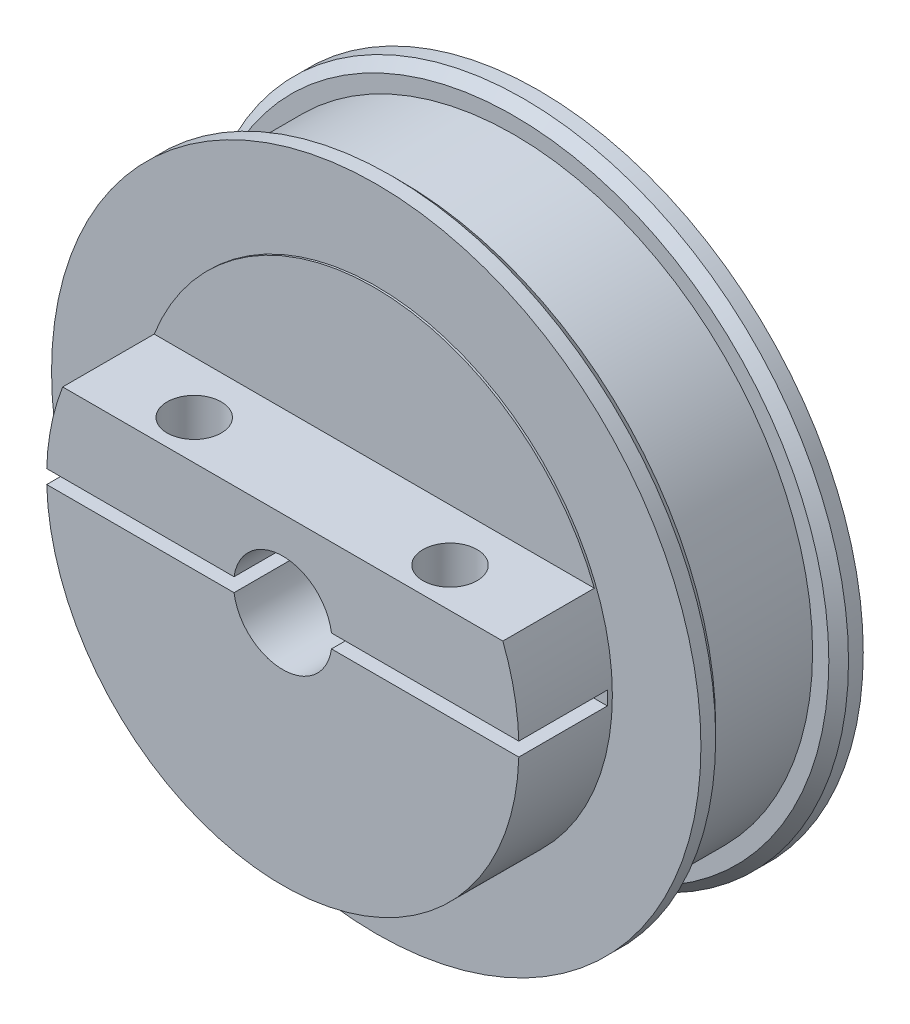
ISO-10303-21;
HEADER;
FILE_DESCRIPTION(('STEP AP214'),'2;1');
FILE_NAME('part.step','',(''),(''),'','','');
FILE_SCHEMA(('AUTOMOTIVE_DESIGN { 1 0 10303 214 1 1 1 1 }'));
ENDSEC;
DATA;
#1=APPLICATION_CONTEXT('core data for automotive mechanical design processes');
#2=APPLICATION_PROTOCOL_DEFINITION('international standard','automotive_design',2000,#1);
#3=PRODUCT_CONTEXT('',#1,'mechanical');
#4=PRODUCT('Part','Part','',(#3));
#5=PRODUCT_RELATED_PRODUCT_CATEGORY('part','',(#4));
#6=PRODUCT_DEFINITION_FORMATION('','',#4);
#7=PRODUCT_DEFINITION_CONTEXT('part definition',#1,'design');
#8=PRODUCT_DEFINITION('design','',#6,#7);
#9=PRODUCT_DEFINITION_SHAPE('','',#8);
#10=(LENGTH_UNIT() NAMED_UNIT(*) SI_UNIT(.MILLI.,.METRE.));
#11=(NAMED_UNIT(*) PLANE_ANGLE_UNIT() SI_UNIT($,.RADIAN.));
#12=(NAMED_UNIT(*) SI_UNIT($,.STERADIAN.) SOLID_ANGLE_UNIT());
#13=UNCERTAINTY_MEASURE_WITH_UNIT(LENGTH_MEASURE(1.E-05),#10,'distance_accuracy_value','');
#14=(GEOMETRIC_REPRESENTATION_CONTEXT(3) GLOBAL_UNCERTAINTY_ASSIGNED_CONTEXT((#13)) GLOBAL_UNIT_ASSIGNED_CONTEXT((#10,
#11,#12)) REPRESENTATION_CONTEXT('',''));
#15=CARTESIAN_POINT('',(0.,0.,0.));
#16=DIRECTION('',(0.,0.,1.));
#17=DIRECTION('',(1.,0.,0.));
#18=AXIS2_PLACEMENT_3D('',#15,#16,#17);
#19=CARTESIAN_POINT('',(0.,0.,26.));
#20=DIRECTION('',(0.,0.,1.));
#21=DIRECTION('',(1.,0.,0.));
#22=AXIS2_PLACEMENT_3D('',#19,#20,#21);
#23=PLANE('',#22);
#24=DIRECTION('',(1.,0.,0.));
#25=VECTOR('',#24,1.);
#26=CARTESIAN_POINT('',(0.,8.7,26.));
#27=LINE('',#26,#25);
#28=CARTESIAN_POINT('',(-22.3676105116304,8.7,26.));
#29=VERTEX_POINT('',#28);
#30=CARTESIAN_POINT('',(22.3676105116304,8.7,26.));
#31=VERTEX_POINT('',#30);
#32=EDGE_CURVE('E109',#29,#31,#27,.T.);
#33=ORIENTED_EDGE('',*,*,#32,.F.);
#34=CARTESIAN_POINT('',(0.,0.,26.));
#35=DIRECTION('',(0.,0.,1.));
#36=DIRECTION('',(1.,0.,0.));
#37=AXIS2_PLACEMENT_3D('',#34,#35,#36);
#38=CIRCLE('',#37,24.);
#39=CARTESIAN_POINT('',(-23.9897894946996,0.699999999999999,26.));
#40=VERTEX_POINT('',#39);
#41=EDGE_CURVE('E113',#29,#40,#38,.T.);
#42=ORIENTED_EDGE('',*,*,#41,.T.);
#43=DIRECTION('',(-1.,0.,0.));
#44=VECTOR('',#43,1.);
#45=CARTESIAN_POINT('',(-25.,0.699999999999999,26.));
#46=LINE('',#45,#44);
#47=CARTESIAN_POINT('',(-4.95075751779463,0.700000000000001,26.));
#48=VERTEX_POINT('',#47);
#49=EDGE_CURVE('E455',#48,#40,#46,.T.);
#50=ORIENTED_EDGE('',*,*,#49,.F.);
#51=CARTESIAN_POINT('',(0.,0.,26.));
#52=DIRECTION('',(0.,0.,1.));
#53=DIRECTION('',(1.,0.,0.));
#54=AXIS2_PLACEMENT_3D('',#51,#52,#53);
#55=CIRCLE('',#54,5.);
#56=CARTESIAN_POINT('',(4.95075751779463,0.700000000000003,26.));
#57=VERTEX_POINT('',#56);
#58=EDGE_CURVE('E147',#57,#48,#55,.T.);
#59=ORIENTED_EDGE('',*,*,#58,.F.);
#60=CARTESIAN_POINT('',(23.9897894946996,0.700000000000005,26.));
#61=VERTEX_POINT('',#60);
#62=EDGE_CURVE('E454',#61,#57,#46,.T.);
#63=ORIENTED_EDGE('',*,*,#62,.F.);
#64=EDGE_CURVE('E117',#61,#31,#38,.T.);
#65=ORIENTED_EDGE('',*,*,#64,.T.);
#66=EDGE_LOOP('',(#33,#42,#50,#59,#63,#65));
#67=FACE_BOUND('',#66,.T.);
#68=ADVANCED_FACE('F34',(#67),#23,.T.);
#69=CARTESIAN_POINT('',(0.,0.,16.5));
#70=DIRECTION('',(0.,0.,1.));
#71=DIRECTION('',(1.,0.,0.));
#72=AXIS2_PLACEMENT_3D('',#69,#70,#71);
#73=PLANE('',#72);
#74=CARTESIAN_POINT('',(0.,0.,16.5));
#75=DIRECTION('',(0.,0.,1.));
#76=DIRECTION('',(1.,0.,0.));
#77=AXIS2_PLACEMENT_3D('',#74,#75,#76);
#78=CIRCLE('',#77,33.);
#79=CARTESIAN_POINT('',(33.,0.,16.5));
#80=VERTEX_POINT('',#79);
#81=EDGE_CURVE('E142',#80,#80,#78,.T.);
#82=ORIENTED_EDGE('',*,*,#81,.T.);
#83=EDGE_LOOP('',(#82));
#84=FACE_BOUND('',#83,.T.);
#85=CARTESIAN_POINT('',(0.,0.,16.5));
#86=DIRECTION('',(0.,0.,1.));
#87=DIRECTION('',(1.,0.,0.));
#88=AXIS2_PLACEMENT_3D('',#85,#86,#87);
#89=CIRCLE('',#88,24.);
#90=CARTESIAN_POINT('',(24.,0.,16.5));
#91=VERTEX_POINT('',#90);
#92=EDGE_CURVE('E144',#91,#91,#89,.T.);
#93=ORIENTED_EDGE('',*,*,#92,.F.);
#94=EDGE_LOOP('',(#93));
#95=FACE_BOUND('',#94,.T.);
#96=ADVANCED_FACE('F251',(#84,#95),#73,.T.);
#97=CARTESIAN_POINT('',(0.,0.,2.5));
#98=DIRECTION('',(0.,0.,1.));
#99=DIRECTION('',(1.,0.,0.));
#100=AXIS2_PLACEMENT_3D('',#97,#98,#99);
#101=PLANE('',#100);
#102=CARTESIAN_POINT('',(0.,0.,2.5));
#103=DIRECTION('',(0.,0.,1.));
#104=DIRECTION('',(1.,0.,0.));
#105=AXIS2_PLACEMENT_3D('',#102,#103,#104);
#106=CIRCLE('',#105,32.);
#107=CARTESIAN_POINT('',(32.,0.,2.5));
#108=VERTEX_POINT('',#107);
#109=EDGE_CURVE('E163',#108,#108,#106,.T.);
#110=ORIENTED_EDGE('',*,*,#109,.T.);
#111=EDGE_LOOP('',(#110));
#112=FACE_BOUND('',#111,.T.);
#113=CARTESIAN_POINT('',(0.,0.,2.5));
#114=DIRECTION('',(0.,0.,1.));
#115=DIRECTION('',(1.,0.,0.));
#116=AXIS2_PLACEMENT_3D('',#113,#114,#115);
#117=CIRCLE('',#116,30.35);
#118=CARTESIAN_POINT('',(30.35,0.,2.5));
#119=VERTEX_POINT('',#118);
#120=EDGE_CURVE('E154',#119,#119,#117,.T.);
#121=ORIENTED_EDGE('',*,*,#120,.F.);
#122=EDGE_LOOP('',(#121));
#123=FACE_BOUND('',#122,.T.);
#124=ADVANCED_FACE('F255',(#112,#123),#101,.T.);
#125=CARTESIAN_POINT('',(0.,0.,2.5));
#126=DIRECTION('',(0.,0.,-1.));
#127=DIRECTION('',(-1.,0.,0.));
#128=AXIS2_PLACEMENT_3D('',#125,#126,#127);
#129=CYLINDRICAL_SURFACE('',#128,33.);
#130=CARTESIAN_POINT('',(0.,0.,1.49999999999999));
#131=DIRECTION('',(0.,0.,1.));
#132=DIRECTION('',(1.,0.,0.));
#133=AXIS2_PLACEMENT_3D('',#130,#131,#132);
#134=CIRCLE('',#133,33.);
#135=CARTESIAN_POINT('',(33.,0.,1.49999999999999));
#136=VERTEX_POINT('',#135);
#137=EDGE_CURVE('E166',#136,#136,#134,.F.);
#138=ORIENTED_EDGE('',*,*,#137,.T.);
#139=EDGE_LOOP('',(#138));
#140=FACE_BOUND('',#139,.T.);
#141=CARTESIAN_POINT('',(0.,0.,0.));
#142=DIRECTION('',(0.,0.,1.));
#143=DIRECTION('',(1.,0.,0.));
#144=AXIS2_PLACEMENT_3D('',#141,#142,#143);
#145=CIRCLE('',#144,33.);
#146=CARTESIAN_POINT('',(33.,0.,0.));
#147=VERTEX_POINT('',#146);
#148=EDGE_CURVE('E158',#147,#147,#145,.T.);
#149=ORIENTED_EDGE('',*,*,#148,.T.);
#150=EDGE_LOOP('',(#149));
#151=FACE_BOUND('',#150,.T.);
#152=ADVANCED_FACE('F260',(#140,#151),#129,.T.);
#153=CARTESIAN_POINT('',(0.,0.,0.));
#154=DIRECTION('',(0.,0.,1.));
#155=DIRECTION('',(1.,0.,0.));
#156=AXIS2_PLACEMENT_3D('',#153,#154,#155);
#157=PLANE('',#156);
#158=CARTESIAN_POINT('',(0.,0.,0.));
#159=DIRECTION('',(0.,0.,1.));
#160=DIRECTION('',(1.,0.,0.));
#161=AXIS2_PLACEMENT_3D('',#158,#159,#160);
#162=CIRCLE('',#161,5.);
#163=CARTESIAN_POINT('',(5.,0.,0.));
#164=VERTEX_POINT('',#163);
#165=EDGE_CURVE('E151',#164,#164,#162,.T.);
#166=ORIENTED_EDGE('',*,*,#165,.T.);
#167=EDGE_LOOP('',(#166));
#168=FACE_BOUND('',#167,.T.);
#169=ORIENTED_EDGE('',*,*,#148,.F.);
#170=EDGE_LOOP('',(#169));
#171=FACE_BOUND('',#170,.T.);
#172=ADVANCED_FACE('F274',(#168,#171),#157,.F.);
#173=CARTESIAN_POINT('',(0.,0.,14.));
#174=DIRECTION('',(0.,0.,-1.));
#175=DIRECTION('',(-1.,0.,0.));
#176=AXIS2_PLACEMENT_3D('',#173,#174,#175);
#177=CYLINDRICAL_SURFACE('',#176,30.35);
#178=CARTESIAN_POINT('',(0.,0.,14.));
#179=DIRECTION('',(0.,0.,1.));
#180=DIRECTION('',(1.,0.,0.));
#181=AXIS2_PLACEMENT_3D('',#178,#179,#180);
#182=CIRCLE('',#181,30.35);
#183=CARTESIAN_POINT('',(30.35,0.,14.));
#184=VERTEX_POINT('',#183);
#185=EDGE_CURVE('E155',#184,#184,#182,.T.);
#186=ORIENTED_EDGE('',*,*,#185,.F.);
#187=EDGE_LOOP('',(#186));
#188=FACE_BOUND('',#187,.T.);
#189=ORIENTED_EDGE('',*,*,#120,.T.);
#190=EDGE_LOOP('',(#189));
#191=FACE_BOUND('',#190,.T.);
#192=ADVANCED_FACE('F268',(#188,#191),#177,.T.);
#193=CARTESIAN_POINT('',(0.,0.,14.));
#194=DIRECTION('',(0.,0.,1.));
#195=DIRECTION('',(1.,0.,0.));
#196=AXIS2_PLACEMENT_3D('',#193,#194,#195);
#197=PLANE('',#196);
#198=CARTESIAN_POINT('',(0.,0.,14.));
#199=DIRECTION('',(0.,0.,1.));
#200=DIRECTION('',(1.,0.,0.));
#201=AXIS2_PLACEMENT_3D('',#198,#199,#200);
#202=CIRCLE('',#201,32.);
#203=CARTESIAN_POINT('',(32.,0.,14.));
#204=VERTEX_POINT('',#203);
#205=EDGE_CURVE('E172',#204,#204,#202,.F.);
#206=ORIENTED_EDGE('',*,*,#205,.T.);
#207=EDGE_LOOP('',(#206));
#208=FACE_BOUND('',#207,.T.);
#209=ORIENTED_EDGE('',*,*,#185,.T.);
#210=EDGE_LOOP('',(#209));
#211=FACE_BOUND('',#210,.T.);
#212=ADVANCED_FACE('F265',(#208,#211),#197,.F.);
#213=CARTESIAN_POINT('',(0.,0.,16.5));
#214=DIRECTION('',(0.,0.,-1.));
#215=DIRECTION('',(-1.,0.,0.));
#216=AXIS2_PLACEMENT_3D('',#213,#214,#215);
#217=CYLINDRICAL_SURFACE('',#216,33.);
#218=CARTESIAN_POINT('',(0.,0.,15.));
#219=DIRECTION('',(0.,0.,1.));
#220=DIRECTION('',(1.,0.,0.));
#221=AXIS2_PLACEMENT_3D('',#218,#219,#220);
#222=CIRCLE('',#221,33.);
#223=CARTESIAN_POINT('',(33.,0.,15.));
#224=VERTEX_POINT('',#223);
#225=EDGE_CURVE('E169',#224,#224,#222,.T.);
#226=ORIENTED_EDGE('',*,*,#225,.T.);
#227=EDGE_LOOP('',(#226));
#228=FACE_BOUND('',#227,.T.);
#229=ORIENTED_EDGE('',*,*,#81,.F.);
#230=EDGE_LOOP('',(#229));
#231=FACE_BOUND('',#230,.T.);
#232=ADVANCED_FACE('F248',(#228,#231),#217,.T.);
#233=CARTESIAN_POINT('',(0.,0.,26.));
#234=DIRECTION('',(0.,0.,-1.));
#235=DIRECTION('',(-1.,0.,0.));
#236=AXIS2_PLACEMENT_3D('',#233,#234,#235);
#237=CYLINDRICAL_SURFACE('',#236,24.);
#238=ORIENTED_EDGE('',*,*,#41,.F.);
#239=DIRECTION('',(0.,0.,-1.));
#240=VECTOR('',#239,1.);
#241=CARTESIAN_POINT('',(-22.3676105116304,8.7,26.));
#242=LINE('',#241,#240);
#243=CARTESIAN_POINT('',(-22.3676105116304,8.7,16.7));
#244=VERTEX_POINT('',#243);
#245=EDGE_CURVE('E125',#29,#244,#242,.T.);
#246=ORIENTED_EDGE('',*,*,#245,.T.);
#247=CARTESIAN_POINT('',(0.,0.,16.7));
#248=DIRECTION('',(0.,0.,1.));
#249=DIRECTION('',(1.,0.,0.));
#250=AXIS2_PLACEMENT_3D('',#247,#248,#249);
#251=CIRCLE('',#250,24.);
#252=CARTESIAN_POINT('',(22.3676105116304,8.7,16.7));
#253=VERTEX_POINT('',#252);
#254=EDGE_CURVE('E11',#253,#244,#251,.T.);
#255=ORIENTED_EDGE('',*,*,#254,.F.);
#256=DIRECTION('',(0.,0.,-1.));
#257=VECTOR('',#256,1.);
#258=CARTESIAN_POINT('',(22.3676105116304,8.7,26.));
#259=LINE('',#258,#257);
#260=EDGE_CURVE('E133',#253,#31,#259,.F.);
#261=ORIENTED_EDGE('',*,*,#260,.T.);
#262=ORIENTED_EDGE('',*,*,#64,.F.);
#263=DIRECTION('',(0.,0.,-1.));
#264=VECTOR('',#263,1.);
#265=CARTESIAN_POINT('',(23.9897894946996,0.700000000000005,26.));
#266=LINE('',#265,#264);
#267=CARTESIAN_POINT('',(23.9897894946996,0.700000000000005,17.));
#268=VERTEX_POINT('',#267);
#269=EDGE_CURVE('E438',#61,#268,#266,.T.);
#270=ORIENTED_EDGE('',*,*,#269,.T.);
#271=CARTESIAN_POINT('',(0.,0.,17.));
#272=DIRECTION('',(0.,0.,1.));
#273=DIRECTION('',(1.,0.,0.));
#274=AXIS2_PLACEMENT_3D('',#271,#272,#273);
#275=CIRCLE('',#274,24.);
#276=CARTESIAN_POINT('',(23.9897894946996,-0.699999999999996,17.));
#277=VERTEX_POINT('',#276);
#278=EDGE_CURVE('E430',#277,#268,#275,.T.);
#279=ORIENTED_EDGE('',*,*,#278,.F.);
#280=DIRECTION('',(0.,0.,-1.));
#281=VECTOR('',#280,1.);
#282=CARTESIAN_POINT('',(23.9897894946996,-0.699999999999996,26.));
#283=LINE('',#282,#281);
#284=CARTESIAN_POINT('',(23.9897894946996,-0.699999999999996,26.));
#285=VERTEX_POINT('',#284);
#286=EDGE_CURVE('E462',#277,#285,#283,.F.);
#287=ORIENTED_EDGE('',*,*,#286,.T.);
#288=CARTESIAN_POINT('',(-23.9897894946996,-0.700000000000002,26.));
#289=VERTEX_POINT('',#288);
#290=EDGE_CURVE('E140',#289,#285,#38,.T.);
#291=ORIENTED_EDGE('',*,*,#290,.F.);
#292=DIRECTION('',(0.,0.,-1.));
#293=VECTOR('',#292,1.);
#294=CARTESIAN_POINT('',(-23.9897894946996,-0.700000000000002,26.));
#295=LINE('',#294,#293);
#296=CARTESIAN_POINT('',(-23.9897894946996,-0.700000000000002,17.));
#297=VERTEX_POINT('',#296);
#298=EDGE_CURVE('E445',#289,#297,#295,.T.);
#299=ORIENTED_EDGE('',*,*,#298,.T.);
#300=CARTESIAN_POINT('',(-23.9897894946996,0.699999999999999,17.));
#301=VERTEX_POINT('',#300);
#302=EDGE_CURVE('E435',#301,#297,#275,.T.);
#303=ORIENTED_EDGE('',*,*,#302,.F.);
#304=DIRECTION('',(0.,0.,-1.));
#305=VECTOR('',#304,1.);
#306=CARTESIAN_POINT('',(-23.9897894946996,0.699999999999999,26.));
#307=LINE('',#306,#305);
#308=EDGE_CURVE('E139',#301,#40,#307,.F.);
#309=ORIENTED_EDGE('',*,*,#308,.T.);
#310=EDGE_LOOP('',(#238,#246,#255,#261,#262,#270,#279,#287,#291,#299,#303,#309));
#311=FACE_BOUND('',#310,.T.);
#312=CARTESIAN_POINT('',(-13.,-20.174241001832,24.1));
#313=CARTESIAN_POINT('',(-12.849288157179,-20.2713551716352,24.0999969433963));
#314=CARTESIAN_POINT('',(-12.697399910894,-20.3668149132256,24.0837824875346));
#315=CARTESIAN_POINT('',(-12.3969170998205,-20.5510938041406,24.0174049459555));
#316=CARTESIAN_POINT('',(-12.2483212330184,-20.6399156127295,23.967255536972));
#317=CARTESIAN_POINT('',(-11.9794450419192,-20.7969731415149,23.8405754693289));
#318=CARTESIAN_POINT('',(-11.8579460485274,-20.8663944712,23.768121475505));
#319=CARTESIAN_POINT('',(-11.6287946661962,-20.9949601498911,23.596923542887));
#320=CARTESIAN_POINT('',(-11.5211225617998,-21.0541191749173,23.4982176673926));
#321=CARTESIAN_POINT('',(-11.340647640857,-21.1518011292401,23.2931950904712));
#322=CARTESIAN_POINT('',(-11.2650412040748,-21.1920838688733,23.1901845577408));
#323=CARTESIAN_POINT('',(-11.132723403254,-21.2618928667944,22.9694219540343));
#324=CARTESIAN_POINT('',(-11.0759923207704,-21.2914303533175,22.8516854448861));
#325=CARTESIAN_POINT('',(-10.9910384144899,-21.3353945059791,22.6221028742834));
#326=CARTESIAN_POINT('',(-10.9600200464264,-21.351312457034,22.5115702352565));
#327=CARTESIAN_POINT('',(-10.91640559265,-21.373645135915,22.2860101784045));
#328=CARTESIAN_POINT('',(-10.9037993499169,-21.3800651033143,22.170985274717));
#329=CARTESIAN_POINT('',(-10.8979046042035,-21.3830697980633,21.9489396954555));
#330=CARTESIAN_POINT('',(-10.9032457690739,-21.3803521928256,21.8419617133724));
#331=CARTESIAN_POINT('',(-10.9300050393064,-21.3666846539916,21.630590492442));
#332=CARTESIAN_POINT('',(-10.951420902534,-21.3557358684985,21.5261968952165));
#333=CARTESIAN_POINT('',(-11.0090880259167,-21.3260640926489,21.3237976015672));
#334=CARTESIAN_POINT('',(-11.0452067264089,-21.3074105463255,21.2257436712989));
#335=CARTESIAN_POINT('',(-11.1307404682853,-21.2628533245368,21.0374143255193));
#336=CARTESIAN_POINT('',(-11.1801574561433,-21.2369485876908,20.9471400512739));
#337=CARTESIAN_POINT('',(-11.2931045679551,-21.1771116034468,20.7720390165985));
#338=CARTESIAN_POINT('',(-11.3572081761813,-21.1428478554889,20.6876968445316));
#339=CARTESIAN_POINT('',(-11.4955887440155,-21.0679288837374,20.5310960825113));
#340=CARTESIAN_POINT('',(-11.5698690513904,-21.0272715560334,20.4588414863795));
#341=CARTESIAN_POINT('',(-11.7337800806294,-20.9362841464911,20.3209429566493));
#342=CARTESIAN_POINT('',(-11.8242001955834,-20.8853996206159,20.2566057106992));
#343=CARTESIAN_POINT('',(-12.0115461706161,-20.7782199434862,20.143949023162));
#344=CARTESIAN_POINT('',(-12.1084750536091,-20.7219222728498,20.0956370870652));
#345=CARTESIAN_POINT('',(-12.3189694389339,-20.5975666373773,20.0098469200332));
#346=CARTESIAN_POINT('',(-12.4330768783874,-20.5289255632783,19.9745454337949));
#347=CARTESIAN_POINT('',(-12.663254729758,-20.3877475645518,19.9238227623137));
#348=CARTESIAN_POINT('',(-12.7793260234728,-20.3152088562192,19.9084107613719));
#349=CARTESIAN_POINT('',(-13.0260507297157,-20.1580272850201,19.8960736228558));
#350=CARTESIAN_POINT('',(-13.1566238427027,-20.0730430295922,19.9018328384013));
#351=CARTESIAN_POINT('',(-13.4139287752807,-19.9020208685234,19.9371012230994));
#352=CARTESIAN_POINT('',(-13.5406569490221,-19.8159820651597,19.9666322451444));
#353=CARTESIAN_POINT('',(-13.7975281548705,-19.6380897708855,20.0522401057887));
#354=CARTESIAN_POINT('',(-13.9270881107708,-19.5463432522373,20.1103087733295));
#355=CARTESIAN_POINT('',(-14.1743496835975,-19.367782640486,20.2532150127494));
#356=CARTESIAN_POINT('',(-14.2920617594735,-19.280964227058,20.3380286966223));
#357=CARTESIAN_POINT('',(-14.4837748177655,-19.137160798849,20.5098210967681));
#358=CARTESIAN_POINT('',(-14.5613816991587,-19.0781119902699,20.5910625498442));
#359=CARTESIAN_POINT('',(-14.704579784096,-18.9679587470009,20.7681997310564));
#360=CARTESIAN_POINT('',(-14.7701888495835,-18.9168425200127,20.8640732784962));
#361=CARTESIAN_POINT('',(-14.8757663375284,-18.8338860220432,21.0508701982227));
#362=CARTESIAN_POINT('',(-14.9182246143305,-18.8002321273904,21.1395742968585));
#363=CARTESIAN_POINT('',(-14.9909577037473,-18.7422879405941,21.3247520312532));
#364=CARTESIAN_POINT('',(-15.0212393287349,-18.7179924131216,21.4212212863422));
#365=CARTESIAN_POINT('',(-15.0679218182441,-18.6804351175815,21.6202582911522));
#366=CARTESIAN_POINT('',(-15.084234136541,-18.667243743445,21.7228605967605));
#367=CARTESIAN_POINT('',(-15.1014102238641,-18.6533521056796,21.9301793125208));
#368=CARTESIAN_POINT('',(-15.1022816460848,-18.6526456539688,22.0348946495923));
#369=CARTESIAN_POINT('',(-15.0892719845803,-18.6631699617008,22.2315542580634));
#370=CARTESIAN_POINT('',(-15.0769434165631,-18.6731444946906,22.3236766238946));
#371=CARTESIAN_POINT('',(-15.0406833165537,-18.7023629933204,22.5040613102457));
#372=CARTESIAN_POINT('',(-15.0167502313168,-18.721608199822,22.5923231123112));
#373=CARTESIAN_POINT('',(-14.9577331267345,-18.7687952095334,22.7654282152351));
#374=CARTESIAN_POINT('',(-14.9223589692519,-18.7969628473805,22.8501094216407));
#375=CARTESIAN_POINT('',(-14.8422505477,-18.8602810812771,23.0120708041663));
#376=CARTESIAN_POINT('',(-14.7975125409588,-18.8954344692022,23.0893480028923));
#377=CARTESIAN_POINT('',(-14.6923433016774,-18.9773591436896,23.2475528842281));
#378=CARTESIAN_POINT('',(-14.6305454743905,-19.0250896154251,23.3270710783559));
#379=CARTESIAN_POINT('',(-14.498382428668,-19.1259989567143,23.4746801949293));
#380=CARTESIAN_POINT('',(-14.4280113881459,-19.1791815248684,23.5427632762886));
#381=CARTESIAN_POINT('',(-14.2646468313247,-19.3010957028801,23.680590890653));
#382=CARTESIAN_POINT('',(-14.1700247381988,-19.3707289840857,23.7476103393658));
#383=CARTESIAN_POINT('',(-13.9730274726646,-19.5133116020224,23.864498080832));
#384=CARTESIAN_POINT('',(-13.8706477800792,-19.586262862014,23.9143562788781));
#385=CARTESIAN_POINT('',(-13.6436095624056,-19.7452262191979,24.0032113281213));
#386=CARTESIAN_POINT('',(-13.5179743859416,-19.8314931201679,24.0392805410176));
#387=CARTESIAN_POINT('',(-13.261860215082,-20.0036729875382,24.0876866288356));
#388=CARTESIAN_POINT('',(-13.1313770696215,-20.089585577224,24.100002664473));
#389=CARTESIAN_POINT('',(-13.,-20.174241001832,24.1));
#390=B_SPLINE_CURVE_WITH_KNOTS('',3,(#312,#313,#314,#315,#316,#317,#318,#319,#320,#321,#322,
#323,#324,#325,#326,#327,#328,#329,#330,#331,#332,#333,#334,#335,#336,#337,#338,#339,#340,#341,
#342,#343,#344,#345,#346,#347,#348,#349,#350,#351,#352,#353,#354,#355,#356,#357,#358,#359,#360,
#361,#362,#363,#364,#365,#366,#367,#368,#369,#370,#371,#372,#373,#374,#375,#376,#377,#378,#379,
#380,#381,#382,#383,#384,#385,#386,#387,#388,#389),.UNSPECIFIED.,.T.,.F.,(4,2,2,2,2,2,2,2,2,2,2,
2,2,2,2,2,2,2,2,2,2,2,2,2,2,2,2,2,2,2,2,2,2,2,2,2,2,2,4),(0.,0.537221309699028,1.07422623306057,
1.54416868940228,2.01343344366252,2.41302160335044,2.81219100642574,3.15804836605943,
3.50371486186524,3.8236068379346,4.1434542030489,4.46047955841181,4.77755134211774,
5.11017985697839,5.44291805853934,5.80769917780284,6.17265090269523,6.58429265684936,
6.99612442550116,7.4618712080665,7.92804663089014,8.4327416464478,8.93698715128983,
9.31636281645884,9.69516899820866,10.0057388091831,10.3161346256221,10.6284836626186,
10.9406778812166,11.2198107714315,11.4989810334221,11.7858735402894,12.0728809360189,
12.4060168814708,12.7393803346735,13.1436295384867,13.5481161277542,14.0160071840321,
14.4843085469866),.UNSPECIFIED.);
#391=CARTESIAN_POINT('',(-13.,-20.174241001832,24.1));
#392=VERTEX_POINT('',#391);
#393=EDGE_CURVE('E197',#392,#392,#390,.T.);
#394=ORIENTED_EDGE('',*,*,#393,.T.);
#395=EDGE_LOOP('',(#394));
#396=FACE_BOUND('',#395,.T.);
#397=CARTESIAN_POINT('',(13.,-20.174241001832,24.1));
#398=CARTESIAN_POINT('',(13.1501267713471,-20.0774981590407,24.0999981787219));
#399=CARTESIAN_POINT('',(13.2992344719462,-19.979020099521,24.0839054720338));
#400=CARTESIAN_POINT('',(13.5908293099329,-19.78182081246,24.0207000606302));
#401=CARTESIAN_POINT('',(13.7333062391205,-19.6830994413188,23.97354111693));
#402=CARTESIAN_POINT('',(13.9994829529944,-19.494604509476,23.8523586674659));
#403=CARTESIAN_POINT('',(14.1237852580266,-19.4046379372412,23.779963414446));
#404=CARTESIAN_POINT('',(14.3580088810165,-19.2319690961474,23.6083544775844));
#405=CARTESIAN_POINT('',(14.4679609765234,-19.1492514098592,23.5091996367402));
#406=CARTESIAN_POINT('',(14.6375427561951,-19.0197288098497,23.3188623509945));
#407=CARTESIAN_POINT('',(14.7023013570543,-18.9696576022825,23.2344443089444));
#408=CARTESIAN_POINT('',(14.8198146948642,-18.877993102472,23.0535020673965));
#409=CARTESIAN_POINT('',(14.8725861341525,-18.8363880224634,22.9569950068833));
#410=CARTESIAN_POINT('',(14.9563190562648,-18.7699477229566,22.7692098455592));
#411=CARTESIAN_POINT('',(14.989394599173,-18.7435117778632,22.6794459763427));
#412=CARTESIAN_POINT('',(15.0433247102771,-18.7002563403524,22.494085016804));
#413=CARTESIAN_POINT('',(15.0641859800839,-18.683431574688,22.3984911570776));
#414=CARTESIAN_POINT('',(15.0924321413794,-18.6606226186674,22.2036100940559));
#415=CARTESIAN_POINT('',(15.0997596126003,-18.6546846187098,22.1043089695129));
#416=CARTESIAN_POINT('',(15.1002285701758,-18.6543050990493,21.9056542369005));
#417=CARTESIAN_POINT('',(15.0933716206731,-18.6598623117479,21.8063006358256));
#418=CARTESIAN_POINT('',(15.066956125713,-18.6811959809353,21.6177482797019));
#419=CARTESIAN_POINT('',(15.0483312033494,-18.6962210758185,21.5283285792871));
#420=CARTESIAN_POINT('',(15.0003274119666,-18.7347569427197,21.3543695728121));
#421=CARTESIAN_POINT('',(14.9709462690636,-18.7582695089892,21.2698313030731));
#422=CARTESIAN_POINT('',(14.900366630545,-18.814389081962,21.1013728292614));
#423=CARTESIAN_POINT('',(14.8584787981455,-18.8475220738365,21.0179200542329));
#424=CARTESIAN_POINT('',(14.7656294102416,-18.9203506867286,20.8593836165826));
#425=CARTESIAN_POINT('',(14.7146633799169,-18.9600495434959,20.7843041111225));
#426=CARTESIAN_POINT('',(14.59518941712,-19.0522206078587,20.6301320518995));
#427=CARTESIAN_POINT('',(14.5251777375972,-19.1057014695258,20.5528112981554));
#428=CARTESIAN_POINT('',(14.3767444964803,-19.2176450858816,20.4109332172284));
#429=CARTESIAN_POINT('',(14.2983172251752,-19.276111217323,20.3463846410917));
#430=CARTESIAN_POINT('',(14.1174062524032,-19.4091199148963,20.217814017092));
#431=CARTESIAN_POINT('',(14.0133481030785,-19.4844423391571,20.1568067261953));
#432=CARTESIAN_POINT('',(13.7979075366273,-19.6375982493071,20.0538195749942));
#433=CARTESIAN_POINT('',(13.6865200633558,-19.7154334493779,20.0118530109264));
#434=CARTESIAN_POINT('',(13.44119690163,-19.8836498843877,19.9423369320862));
#435=CARTESIAN_POINT('',(13.3064159409859,-19.974131419255,19.9179688387228));
#436=CARTESIAN_POINT('',(13.0334324195535,-20.1533203857353,19.8958033727487));
#437=CARTESIAN_POINT('',(12.8952283580453,-20.2420270072594,19.8980178675797));
#438=CARTESIAN_POINT('',(12.6157842636484,-20.4173907226684,19.9305431523531));
#439=CARTESIAN_POINT('',(12.4745554489101,-20.5039399033848,19.9615602742646));
#440=CARTESIAN_POINT('',(12.1977345430424,-20.6698151670396,20.0538210261493));
#441=CARTESIAN_POINT('',(12.0621393836581,-20.7491452105173,20.1150479626531));
#442=CARTESIAN_POINT('',(11.8156611263499,-20.8903893990291,20.2605233176622));
#443=CARTESIAN_POINT('',(11.7036578211413,-20.9532477038996,20.3419407522805));
#444=CARTESIAN_POINT('',(11.4951306376331,-21.0683683301127,20.528648109179));
#445=CARTESIAN_POINT('',(11.3985871294383,-21.1206441111452,20.6339073417006));
#446=CARTESIAN_POINT('',(11.2397608628849,-21.2055344264129,20.8482073063307));
#447=CARTESIAN_POINT('',(11.1745179719783,-21.2399169040777,20.9543563761219));
#448=CARTESIAN_POINT('',(11.0631458778713,-21.2981402514717,21.178874548846));
#449=CARTESIAN_POINT('',(11.0169984929352,-21.3219911502749,21.2972318929047));
#450=CARTESIAN_POINT('',(10.9509372728331,-21.3559870215175,21.5268873004661));
#451=CARTESIAN_POINT('',(10.9284992754775,-21.3674546646858,21.6372695334279));
#452=CARTESIAN_POINT('',(10.9016064154404,-21.3811884200274,21.8607529093438));
#453=CARTESIAN_POINT('',(10.8971434942054,-21.3834586555685,21.9738528110348));
#454=CARTESIAN_POINT('',(10.9061397962244,-21.3788710219699,22.1923186503085));
#455=CARTESIAN_POINT('',(10.9185408642651,-21.3725521024551,22.2977418373124));
#456=CARTESIAN_POINT('',(10.9588389688705,-21.3519169015532,22.5047561129009));
#457=CARTESIAN_POINT('',(10.9867349904744,-21.3376011439799,22.6063474520163));
#458=CARTESIAN_POINT('',(11.0569529250422,-21.3012992052659,22.8034734431848));
#459=CARTESIAN_POINT('',(11.0993406457585,-21.2792780223845,22.8989780655941));
#460=CARTESIAN_POINT('',(11.1967660010032,-21.2281757758567,23.0812173870534));
#461=CARTESIAN_POINT('',(11.2518059648451,-21.1990934121714,23.1679504669986));
#462=CARTESIAN_POINT('',(11.3761571884757,-21.1326358068239,23.3359274937749));
#463=CARTESIAN_POINT('',(11.4461290893197,-21.0948661176933,23.4165246331335));
#464=CARTESIAN_POINT('',(11.5955065151435,-21.0131263383074,23.5647636981414));
#465=CARTESIAN_POINT('',(11.6749159150308,-20.9691536998113,23.6324002723789));
#466=CARTESIAN_POINT('',(11.8494520292671,-20.8710686687894,23.7604395004705));
#467=CARTESIAN_POINT('',(11.9453536532459,-20.8163764770705,23.8193387060345));
#468=CARTESIAN_POINT('',(12.1427445266856,-20.7018547723756,23.9202644063657));
#469=CARTESIAN_POINT('',(12.2442351586311,-20.6420239862617,23.9622867049881));
#470=CARTESIAN_POINT('',(12.4543057888004,-20.5159897649507,24.0309854124649));
#471=CARTESIAN_POINT('',(12.5630077357706,-20.449628460585,24.0569956925796));
#472=CARTESIAN_POINT('',(12.7813187428715,-20.3138983176997,24.0915091287559));
#473=CARTESIAN_POINT('',(12.8909283279035,-20.2445276238111,24.100001323214));
#474=CARTESIAN_POINT('',(13.,-20.174241001832,24.1));
#475=B_SPLINE_CURVE_WITH_KNOTS('',3,(#397,#398,#399,#400,#401,#402,#403,#404,#405,#406,#407,
#408,#409,#410,#411,#412,#413,#414,#415,#416,#417,#418,#419,#420,#421,#422,#423,#424,#425,#426,
#427,#428,#429,#430,#431,#432,#433,#434,#435,#436,#437,#438,#439,#440,#441,#442,#443,#444,#445,
#446,#447,#448,#449,#450,#451,#452,#453,#454,#455,#456,#457,#458,#459,#460,#461,#462,#463,#464,
#465,#466,#467,#468,#469,#470,#471,#472,#473,#474),.UNSPECIFIED.,.T.,.F.,(4,2,2,2,2,2,2,2,2,2,2,
2,2,2,2,2,2,2,2,2,2,2,2,2,2,2,2,2,2,2,2,2,2,2,2,2,2,2,4),(0.,0.535272629463088,1.07134376420822,
1.57779646625898,2.08314445250074,2.43463002371754,2.78562280591358,3.08212452439697,
3.378463408323,3.67605671558372,3.97361720842436,4.25011088234736,4.52666304130016,
4.82279311767626,5.11906956831915,5.46946159877722,5.82009288046328,6.24508390506699,
6.67037124802342,7.16062169556716,7.65109101701643,8.15391511121114,8.65646166335493,
9.10994739890111,9.56285268061542,9.94838650450124,10.3335523939743,10.6714566747319,
11.009209449981,11.3267185618244,11.6442068784269,11.9631565136319,12.2821649154558,
12.6204183924994,12.958811234727,13.3327068008932,13.7066952721229,14.0953440255344,
14.4842358947136),.UNSPECIFIED.);
#476=CARTESIAN_POINT('',(13.,-20.174241001832,24.1));
#477=VERTEX_POINT('',#476);
#478=EDGE_CURVE('E189',#477,#477,#475,.T.);
#479=ORIENTED_EDGE('',*,*,#478,.T.);
#480=EDGE_LOOP('',(#479));
#481=FACE_BOUND('',#480,.T.);
#482=ORIENTED_EDGE('',*,*,#92,.T.);
#483=EDGE_LOOP('',(#482));
#484=FACE_BOUND('',#483,.T.);
#485=ADVANCED_FACE('F136',(#311,#396,#481,#484),#237,.T.);
#486=DIRECTION('',(1.,0.,0.));
#487=VECTOR('',#486,1.);
#488=CARTESIAN_POINT('',(-25.,-0.700000000000002,26.));
#489=LINE('',#488,#487);
#490=CARTESIAN_POINT('',(-4.95075751779463,-0.699999999999999,26.));
#491=VERTEX_POINT('',#490);
#492=EDGE_CURVE('E457',#289,#491,#489,.T.);
#493=ORIENTED_EDGE('',*,*,#492,.F.);
#494=ORIENTED_EDGE('',*,*,#290,.T.);
#495=CARTESIAN_POINT('',(4.95075751779463,-0.699999999999998,26.));
#496=VERTEX_POINT('',#495);
#497=EDGE_CURVE('E459',#496,#285,#489,.T.);
#498=ORIENTED_EDGE('',*,*,#497,.F.);
#499=EDGE_CURVE('E442',#491,#496,#55,.T.);
#500=ORIENTED_EDGE('',*,*,#499,.F.);
#501=EDGE_LOOP('',(#493,#494,#498,#500));
#502=FACE_BOUND('',#501,.T.);
#503=ADVANCED_FACE('F239',(#502),#23,.T.);
#504=CARTESIAN_POINT('',(0.,0.,2.5));
#505=DIRECTION('',(0.,0.,-1.));
#506=DIRECTION('',(-1.,0.,0.));
#507=AXIS2_PLACEMENT_3D('',#504,#505,#506);
#508=CONICAL_SURFACE('',#507,32.,0.785398163397445);
#509=ORIENTED_EDGE('',*,*,#137,.F.);
#510=EDGE_LOOP('',(#509));
#511=FACE_BOUND('',#510,.T.);
#512=ORIENTED_EDGE('',*,*,#109,.F.);
#513=EDGE_LOOP('',(#512));
#514=FACE_BOUND('',#513,.T.);
#515=ADVANCED_FACE('F241',(#511,#514),#508,.T.);
#516=CARTESIAN_POINT('',(0.,0.,15.));
#517=DIRECTION('',(0.,0.,1.));
#518=DIRECTION('',(1.,0.,0.));
#519=AXIS2_PLACEMENT_3D('',#516,#517,#518);
#520=CONICAL_SURFACE('',#519,33.,0.785398163397452);
#521=ORIENTED_EDGE('',*,*,#205,.F.);
#522=EDGE_LOOP('',(#521));
#523=FACE_BOUND('',#522,.T.);
#524=ORIENTED_EDGE('',*,*,#225,.F.);
#525=EDGE_LOOP('',(#524));
#526=FACE_BOUND('',#525,.T.);
#527=ADVANCED_FACE('F36',(#523,#526),#520,.T.);
#528=CARTESIAN_POINT('',(0.,0.,0.));
#529=DIRECTION('',(0.,0.,1.));
#530=DIRECTION('',(1.,0.,0.));
#531=AXIS2_PLACEMENT_3D('',#528,#529,#530);
#532=CYLINDRICAL_SURFACE('',#531,5.);
#533=ORIENTED_EDGE('',*,*,#58,.T.);
#534=DIRECTION('',(0.,0.,1.));
#535=VECTOR('',#534,1.);
#536=CARTESIAN_POINT('',(-4.95075751779463,0.700000000000001,0.));
#537=LINE('',#536,#535);
#538=CARTESIAN_POINT('',(-4.95075751779463,0.700000000000001,17.));
#539=VERTEX_POINT('',#538);
#540=EDGE_CURVE('E42',#48,#539,#537,.F.);
#541=ORIENTED_EDGE('',*,*,#540,.T.);
#542=CARTESIAN_POINT('',(0.,0.,17.));
#543=DIRECTION('',(0.,0.,1.));
#544=DIRECTION('',(1.,0.,0.));
#545=AXIS2_PLACEMENT_3D('',#542,#543,#544);
#546=CIRCLE('',#545,5.);
#547=CARTESIAN_POINT('',(-4.95075751779463,-0.699999999999999,17.));
#548=VERTEX_POINT('',#547);
#549=EDGE_CURVE('E178',#548,#539,#546,.F.);
#550=ORIENTED_EDGE('',*,*,#549,.F.);
#551=DIRECTION('',(0.,0.,1.));
#552=VECTOR('',#551,1.);
#553=CARTESIAN_POINT('',(-4.95075751779463,-0.699999999999999,0.));
#554=LINE('',#553,#552);
#555=EDGE_CURVE('E184',#548,#491,#554,.T.);
#556=ORIENTED_EDGE('',*,*,#555,.T.);
#557=ORIENTED_EDGE('',*,*,#499,.T.);
#558=DIRECTION('',(0.,0.,1.));
#559=VECTOR('',#558,1.);
#560=CARTESIAN_POINT('',(4.95075751779463,-0.699999999999998,0.));
#561=LINE('',#560,#559);
#562=CARTESIAN_POINT('',(4.95075751779463,-0.699999999999998,17.));
#563=VERTEX_POINT('',#562);
#564=EDGE_CURVE('E177',#496,#563,#561,.F.);
#565=ORIENTED_EDGE('',*,*,#564,.T.);
#566=CARTESIAN_POINT('',(4.95075751779463,0.700000000000003,17.));
#567=VERTEX_POINT('',#566);
#568=EDGE_CURVE('E175',#567,#563,#546,.F.);
#569=ORIENTED_EDGE('',*,*,#568,.F.);
#570=DIRECTION('',(0.,0.,1.));
#571=VECTOR('',#570,1.);
#572=CARTESIAN_POINT('',(4.95075751779463,0.700000000000003,0.));
#573=LINE('',#572,#571);
#574=EDGE_CURVE('E181',#567,#57,#573,.T.);
#575=ORIENTED_EDGE('',*,*,#574,.T.);
#576=EDGE_LOOP('',(#533,#541,#550,#556,#557,#565,#569,#575));
#577=FACE_BOUND('',#576,.T.);
#578=ORIENTED_EDGE('',*,*,#165,.F.);
#579=EDGE_LOOP('',(#578));
#580=FACE_BOUND('',#579,.T.);
#581=ADVANCED_FACE('F236',(#577,#580),#532,.F.);
#582=CARTESIAN_POINT('',(-25.,-0.700000000000002,17.));
#583=DIRECTION('',(0.,0.,1.));
#584=DIRECTION('',(1.,0.,0.));
#585=AXIS2_PLACEMENT_3D('',#582,#583,#584);
#586=PLANE('',#585);
#587=ORIENTED_EDGE('',*,*,#278,.T.);
#588=DIRECTION('',(-1.,0.,0.));
#589=VECTOR('',#588,1.);
#590=CARTESIAN_POINT('',(-25.,0.699999999999999,17.));
#591=LINE('',#590,#589);
#592=EDGE_CURVE('E57',#268,#567,#591,.T.);
#593=ORIENTED_EDGE('',*,*,#592,.T.);
#594=ORIENTED_EDGE('',*,*,#568,.T.);
#595=DIRECTION('',(1.,0.,0.));
#596=VECTOR('',#595,1.);
#597=CARTESIAN_POINT('',(-25.,-0.700000000000002,17.));
#598=LINE('',#597,#596);
#599=EDGE_CURVE('E432',#563,#277,#598,.T.);
#600=ORIENTED_EDGE('',*,*,#599,.T.);
#601=EDGE_LOOP('',(#587,#593,#594,#600));
#602=FACE_BOUND('',#601,.T.);
#603=ADVANCED_FACE('F226',(#602),#586,.T.);
#604=CARTESIAN_POINT('',(-25.,-0.700000000000002,17.));
#605=DIRECTION('',(0.,-1.,0.));
#606=DIRECTION('',(1.,0.,0.));
#607=AXIS2_PLACEMENT_3D('',#604,#605,#606);
#608=PLANE('',#607);
#609=CARTESIAN_POINT('',(13.,-0.699999999999996,22.));
#610=DIRECTION('',(0.,1.,0.));
#611=DIRECTION('',(0.,0.,1.));
#612=AXIS2_PLACEMENT_3D('',#609,#610,#611);
#613=CIRCLE('',#612,2.09999999999999);
#614=CARTESIAN_POINT('',(13.,-0.699999999999996,24.1));
#615=VERTEX_POINT('',#614);
#616=EDGE_CURVE('E196',#615,#615,#613,.T.);
#617=ORIENTED_EDGE('',*,*,#616,.F.);
#618=EDGE_LOOP('',(#617));
#619=FACE_BOUND('',#618,.T.);
#620=ORIENTED_EDGE('',*,*,#599,.F.);
#621=ORIENTED_EDGE('',*,*,#564,.F.);
#622=ORIENTED_EDGE('',*,*,#497,.T.);
#623=ORIENTED_EDGE('',*,*,#286,.F.);
#624=EDGE_LOOP('',(#620,#621,#622,#623));
#625=FACE_BOUND('',#624,.T.);
#626=ADVANCED_FACE('F231',(#619,#625),#608,.F.);
#627=CARTESIAN_POINT('',(-25.,0.699999999999999,17.));
#628=DIRECTION('',(0.,1.,0.));
#629=DIRECTION('',(-1.,0.,0.));
#630=AXIS2_PLACEMENT_3D('',#627,#628,#629);
#631=PLANE('',#630);
#632=CARTESIAN_POINT('',(13.,0.700000000000004,22.));
#633=DIRECTION('',(0.,-1.,0.));
#634=DIRECTION('',(-1.,0.,0.));
#635=AXIS2_PLACEMENT_3D('',#632,#633,#634);
#636=CIRCLE('',#635,2.75);
#637=CARTESIAN_POINT('',(10.25,0.700000000000003,22.));
#638=VERTEX_POINT('',#637);
#639=EDGE_CURVE('E120',#638,#638,#636,.T.);
#640=ORIENTED_EDGE('',*,*,#639,.F.);
#641=EDGE_LOOP('',(#640));
#642=FACE_BOUND('',#641,.T.);
#643=ORIENTED_EDGE('',*,*,#62,.T.);
#644=ORIENTED_EDGE('',*,*,#574,.F.);
#645=ORIENTED_EDGE('',*,*,#592,.F.);
#646=ORIENTED_EDGE('',*,*,#269,.F.);
#647=EDGE_LOOP('',(#643,#644,#645,#646));
#648=FACE_BOUND('',#647,.T.);
#649=ADVANCED_FACE('F227',(#642,#648),#631,.F.);
#650=CARTESIAN_POINT('',(-13.,0.7,22.));
#651=DIRECTION('',(0.,-1.,0.));
#652=DIRECTION('',(1.,0.,0.));
#653=AXIS2_PLACEMENT_3D('',#650,#651,#652);
#654=CIRCLE('',#653,2.75);
#655=CARTESIAN_POINT('',(-10.25,0.700000000000001,22.));
#656=VERTEX_POINT('',#655);
#657=EDGE_CURVE('E472',#656,#656,#654,.T.);
#658=ORIENTED_EDGE('',*,*,#657,.F.);
#659=EDGE_LOOP('',(#658));
#660=FACE_BOUND('',#659,.T.);
#661=EDGE_CURVE('E440',#539,#301,#591,.T.);
#662=ORIENTED_EDGE('',*,*,#661,.F.);
#663=ORIENTED_EDGE('',*,*,#540,.F.);
#664=ORIENTED_EDGE('',*,*,#49,.T.);
#665=ORIENTED_EDGE('',*,*,#308,.F.);
#666=EDGE_LOOP('',(#662,#663,#664,#665));
#667=FACE_BOUND('',#666,.T.);
#668=ADVANCED_FACE('F230',(#660,#667),#631,.F.);
#669=CARTESIAN_POINT('',(-13.,-0.699999999999999,22.));
#670=DIRECTION('',(0.,1.,0.));
#671=DIRECTION('',(0.,0.,1.));
#672=AXIS2_PLACEMENT_3D('',#669,#670,#671);
#673=CIRCLE('',#672,2.09999999999999);
#674=CARTESIAN_POINT('',(-13.,-0.699999999999999,24.1));
#675=VERTEX_POINT('',#674);
#676=EDGE_CURVE('E132',#675,#675,#673,.T.);
#677=ORIENTED_EDGE('',*,*,#676,.F.);
#678=EDGE_LOOP('',(#677));
#679=FACE_BOUND('',#678,.T.);
#680=ORIENTED_EDGE('',*,*,#492,.T.);
#681=ORIENTED_EDGE('',*,*,#555,.F.);
#682=EDGE_CURVE('E49',#297,#548,#598,.T.);
#683=ORIENTED_EDGE('',*,*,#682,.F.);
#684=ORIENTED_EDGE('',*,*,#298,.F.);
#685=EDGE_LOOP('',(#680,#681,#683,#684));
#686=FACE_BOUND('',#685,.T.);
#687=ADVANCED_FACE('F225',(#679,#686),#608,.F.);
#688=ORIENTED_EDGE('',*,*,#302,.T.);
#689=ORIENTED_EDGE('',*,*,#682,.T.);
#690=ORIENTED_EDGE('',*,*,#549,.T.);
#691=ORIENTED_EDGE('',*,*,#661,.T.);
#692=EDGE_LOOP('',(#688,#689,#690,#691));
#693=FACE_BOUND('',#692,.T.);
#694=ADVANCED_FACE('F221',(#693),#586,.T.);
#695=CARTESIAN_POINT('',(-13.,8.7,22.));
#696=DIRECTION('',(0.,-1.,0.));
#697=DIRECTION('',(1.,0.,0.));
#698=AXIS2_PLACEMENT_3D('',#695,#696,#697);
#699=CYLINDRICAL_SURFACE('',#698,2.75);
#700=CARTESIAN_POINT('',(-13.,8.7,22.));
#701=DIRECTION('',(0.,-1.,0.));
#702=DIRECTION('',(1.,0.,0.));
#703=AXIS2_PLACEMENT_3D('',#700,#701,#702);
#704=CIRCLE('',#703,2.75);
#705=CARTESIAN_POINT('',(-10.25,8.7,22.));
#706=VERTEX_POINT('',#705);
#707=EDGE_CURVE('E121',#706,#706,#704,.F.);
#708=ORIENTED_EDGE('',*,*,#707,.T.);
#709=EDGE_LOOP('',(#708));
#710=FACE_BOUND('',#709,.T.);
#711=ORIENTED_EDGE('',*,*,#657,.T.);
#712=EDGE_LOOP('',(#711));
#713=FACE_BOUND('',#712,.T.);
#714=ADVANCED_FACE('F217',(#710,#713),#699,.F.);
#715=CARTESIAN_POINT('',(13.,8.7,22.));
#716=DIRECTION('',(0.,-1.,0.));
#717=DIRECTION('',(1.,0.,0.));
#718=AXIS2_PLACEMENT_3D('',#715,#716,#717);
#719=CYLINDRICAL_SURFACE('',#718,2.75);
#720=CARTESIAN_POINT('',(13.,8.7,22.));
#721=DIRECTION('',(0.,-1.,0.));
#722=DIRECTION('',(1.,0.,0.));
#723=AXIS2_PLACEMENT_3D('',#720,#721,#722);
#724=CIRCLE('',#723,2.75);
#725=CARTESIAN_POINT('',(15.75,8.7,22.));
#726=VERTEX_POINT('',#725);
#727=EDGE_CURVE('E195',#726,#726,#724,.F.);
#728=ORIENTED_EDGE('',*,*,#727,.T.);
#729=EDGE_LOOP('',(#728));
#730=FACE_BOUND('',#729,.T.);
#731=ORIENTED_EDGE('',*,*,#639,.T.);
#732=EDGE_LOOP('',(#731));
#733=FACE_BOUND('',#732,.T.);
#734=ADVANCED_FACE('F214',(#730,#733),#719,.F.);
#735=CARTESIAN_POINT('',(-13.,8.7,22.));
#736=DIRECTION('',(0.,-1.,0.));
#737=DIRECTION('',(1.,0.,0.));
#738=AXIS2_PLACEMENT_3D('',#735,#736,#737);
#739=PLANE('',#738);
#740=ORIENTED_EDGE('',*,*,#245,.F.);
#741=ORIENTED_EDGE('',*,*,#32,.T.);
#742=ORIENTED_EDGE('',*,*,#260,.F.);
#743=DIRECTION('',(1.,0.,0.));
#744=VECTOR('',#743,1.);
#745=CARTESIAN_POINT('',(-38.9537016110211,8.7,16.7));
#746=LINE('',#745,#744);
#747=EDGE_CURVE('E129',#244,#253,#746,.T.);
#748=ORIENTED_EDGE('',*,*,#747,.F.);
#749=EDGE_LOOP('',(#740,#741,#742,#748));
#750=FACE_BOUND('',#749,.T.);
#751=ORIENTED_EDGE('',*,*,#707,.F.);
#752=EDGE_LOOP('',(#751));
#753=FACE_BOUND('',#752,.T.);
#754=ORIENTED_EDGE('',*,*,#727,.F.);
#755=EDGE_LOOP('',(#754));
#756=FACE_BOUND('',#755,.T.);
#757=ADVANCED_FACE('F126',(#750,#753,#756),#739,.F.);
#758=CARTESIAN_POINT('',(13.,-0.699999999999997,22.));
#759=DIRECTION('',(0.,1.,0.));
#760=DIRECTION('',(0.,0.,1.));
#761=AXIS2_PLACEMENT_3D('',#758,#759,#760);
#762=CYLINDRICAL_SURFACE('',#761,2.09999999999999);
#763=ORIENTED_EDGE('',*,*,#616,.T.);
#764=EDGE_LOOP('',(#763));
#765=FACE_BOUND('',#764,.T.);
#766=ORIENTED_EDGE('',*,*,#478,.F.);
#767=EDGE_LOOP('',(#766));
#768=FACE_BOUND('',#767,.T.);
#769=ADVANCED_FACE('F204',(#765,#768),#762,.F.);
#770=CARTESIAN_POINT('',(-13.,-0.7,22.));
#771=DIRECTION('',(0.,1.,0.));
#772=DIRECTION('',(0.,0.,1.));
#773=AXIS2_PLACEMENT_3D('',#770,#771,#772);
#774=CYLINDRICAL_SURFACE('',#773,2.09999999999999);
#775=ORIENTED_EDGE('',*,*,#676,.T.);
#776=EDGE_LOOP('',(#775));
#777=FACE_BOUND('',#776,.T.);
#778=ORIENTED_EDGE('',*,*,#393,.F.);
#779=EDGE_LOOP('',(#778));
#780=FACE_BOUND('',#779,.T.);
#781=ADVANCED_FACE('F208',(#777,#780),#774,.F.);
#782=CARTESIAN_POINT('',(-38.9537016110211,8.7,16.7));
#783=DIRECTION('',(0.,0.,1.));
#784=DIRECTION('',(1.,0.,0.));
#785=AXIS2_PLACEMENT_3D('',#782,#783,#784);
#786=PLANE('',#785);
#787=ORIENTED_EDGE('',*,*,#254,.T.);
#788=ORIENTED_EDGE('',*,*,#747,.T.);
#789=EDGE_LOOP('',(#787,#788));
#790=FACE_BOUND('',#789,.T.);
#791=ADVANCED_FACE('F335',(#790),#786,.T.);
#792=CLOSED_SHELL('',(#68,#96,#124,#152,#172,#192,#212,#232,#485,#503,#515,#527,#581,#603,#626,
#649,#668,#687,#694,#714,#734,#757,#769,#781,#791));
#793=MANIFOLD_SOLID_BREP('B2',#792);
#794=ADVANCED_BREP_SHAPE_REPRESENTATION('',(#18,#793),#14);
#795=SHAPE_DEFINITION_REPRESENTATION(#9,#794);
ENDSEC;
END-ISO-10303-21;
